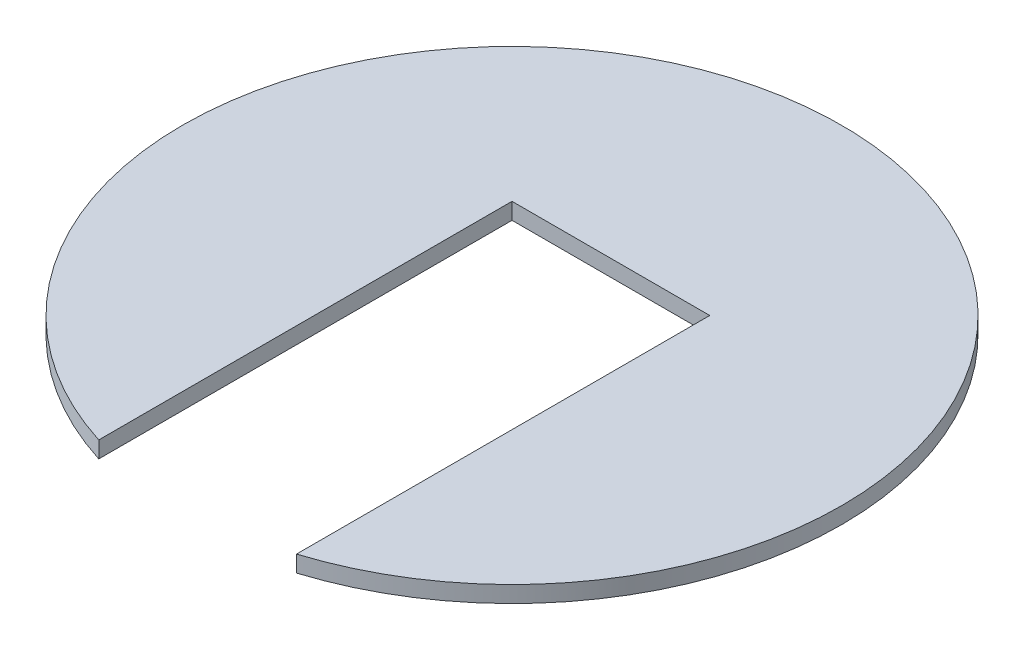
ISO-10303-21;
HEADER;
FILE_DESCRIPTION(('STEP AP214'),'2;1');
FILE_NAME('part.step','',(''),(''),'','','');
FILE_SCHEMA(('AUTOMOTIVE_DESIGN { 1 0 10303 214 1 1 1 1 }'));
ENDSEC;
DATA;
#1=APPLICATION_CONTEXT('core data for automotive mechanical design processes');
#2=APPLICATION_PROTOCOL_DEFINITION('international standard','automotive_design',2000,#1);
#3=PRODUCT_CONTEXT('',#1,'mechanical');
#4=PRODUCT('Part','Part','',(#3));
#5=PRODUCT_RELATED_PRODUCT_CATEGORY('part','',(#4));
#6=PRODUCT_DEFINITION_FORMATION('','',#4);
#7=PRODUCT_DEFINITION_CONTEXT('part definition',#1,'design');
#8=PRODUCT_DEFINITION('design','',#6,#7);
#9=PRODUCT_DEFINITION_SHAPE('','',#8);
#10=(LENGTH_UNIT() NAMED_UNIT(*) SI_UNIT(.MILLI.,.METRE.));
#11=(NAMED_UNIT(*) PLANE_ANGLE_UNIT() SI_UNIT($,.RADIAN.));
#12=(NAMED_UNIT(*) SI_UNIT($,.STERADIAN.) SOLID_ANGLE_UNIT());
#13=UNCERTAINTY_MEASURE_WITH_UNIT(LENGTH_MEASURE(1.E-05),#10,'distance_accuracy_value','');
#14=(GEOMETRIC_REPRESENTATION_CONTEXT(3) GLOBAL_UNCERTAINTY_ASSIGNED_CONTEXT((#13)) GLOBAL_UNIT_ASSIGNED_CONTEXT((#10,
#11,#12)) REPRESENTATION_CONTEXT('',''));
#15=CARTESIAN_POINT('',(0.,0.,0.));
#16=DIRECTION('',(0.,0.,1.));
#17=DIRECTION('',(1.,0.,0.));
#18=AXIS2_PLACEMENT_3D('',#15,#16,#17);
#19=CARTESIAN_POINT('',(0.,0.,0.));
#20=DIRECTION('',(0.,1.,0.));
#21=DIRECTION('',(0.,0.,1.));
#22=AXIS2_PLACEMENT_3D('',#19,#20,#21);
#23=PLANE('',#22);
#24=CARTESIAN_POINT('',(0.,0.,0.));
#25=DIRECTION('',(0.,1.,0.));
#26=DIRECTION('',(0.,0.,1.));
#27=AXIS2_PLACEMENT_3D('',#24,#25,#26);
#28=CIRCLE('',#27,127.);
#29=CARTESIAN_POINT('',(38.099999999999,0.,121.150278579952));
#30=VERTEX_POINT('',#29);
#31=CARTESIAN_POINT('',(-38.099999999999,0.,121.150278579952));
#32=VERTEX_POINT('',#31);
#33=EDGE_CURVE('E36',#30,#32,#28,.T.);
#34=ORIENTED_EDGE('',*,*,#33,.F.);
#35=DIRECTION('',(0.,0.,-1.));
#36=VECTOR('',#35,1.);
#37=CARTESIAN_POINT('',(38.1,0.,-38.1));
#38=LINE('',#37,#36);
#39=CARTESIAN_POINT('',(38.1,0.,-38.1));
#40=VERTEX_POINT('',#39);
#41=EDGE_CURVE('E106',#30,#40,#38,.T.);
#42=ORIENTED_EDGE('',*,*,#41,.T.);
#43=DIRECTION('',(-1.,0.,0.));
#44=VECTOR('',#43,1.);
#45=CARTESIAN_POINT('',(-38.1,0.,-38.1));
#46=LINE('',#45,#44);
#47=CARTESIAN_POINT('',(-38.1,0.,-38.1));
#48=VERTEX_POINT('',#47);
#49=EDGE_CURVE('E73',#40,#48,#46,.T.);
#50=ORIENTED_EDGE('',*,*,#49,.T.);
#51=DIRECTION('',(0.,0.,1.));
#52=VECTOR('',#51,1.);
#53=CARTESIAN_POINT('',(-38.1,0.,142.557146436089));
#54=LINE('',#53,#52);
#55=EDGE_CURVE('E84',#48,#32,#54,.T.);
#56=ORIENTED_EDGE('',*,*,#55,.T.);
#57=EDGE_LOOP('',(#34,#42,#50,#56));
#58=FACE_BOUND('',#57,.T.);
#59=ADVANCED_FACE('F33',(#58),#23,.F.);
#60=CARTESIAN_POINT('',(-38.1,0.,142.557146436089));
#61=DIRECTION('',(-1.,0.,0.));
#62=DIRECTION('',(0.,0.,1.));
#63=AXIS2_PLACEMENT_3D('',#60,#61,#62);
#64=PLANE('',#63);
#65=DIRECTION('',(0.,1.,0.));
#66=VECTOR('',#65,1.);
#67=CARTESIAN_POINT('',(-38.1,0.,-38.1));
#68=LINE('',#67,#66);
#69=CARTESIAN_POINT('',(-38.1,6.35,-38.1));
#70=VERTEX_POINT('',#69);
#71=EDGE_CURVE('E77',#48,#70,#68,.T.);
#72=ORIENTED_EDGE('',*,*,#71,.T.);
#73=DIRECTION('',(0.,0.,1.));
#74=VECTOR('',#73,1.);
#75=CARTESIAN_POINT('',(-38.1,6.35,0.));
#76=LINE('',#75,#74);
#77=CARTESIAN_POINT('',(-38.099999999999,6.35,121.150278579952));
#78=VERTEX_POINT('',#77);
#79=EDGE_CURVE('E82',#78,#70,#76,.F.);
#80=ORIENTED_EDGE('',*,*,#79,.F.);
#81=DIRECTION('',(0.,1.,0.));
#82=VECTOR('',#81,1.);
#83=CARTESIAN_POINT('',(-38.0999999999981,0.,121.150278579953));
#84=LINE('',#83,#82);
#85=EDGE_CURVE('E96',#32,#78,#84,.T.);
#86=ORIENTED_EDGE('',*,*,#85,.F.);
#87=ORIENTED_EDGE('',*,*,#55,.F.);
#88=EDGE_LOOP('',(#72,#80,#86,#87));
#89=FACE_BOUND('',#88,.T.);
#90=ADVANCED_FACE('F79',(#89),#64,.F.);
#91=CARTESIAN_POINT('',(-38.1,0.,-38.1));
#92=DIRECTION('',(0.,0.,-1.));
#93=DIRECTION('',(-1.,0.,0.));
#94=AXIS2_PLACEMENT_3D('',#91,#92,#93);
#95=PLANE('',#94);
#96=DIRECTION('',(0.,1.,0.));
#97=VECTOR('',#96,1.);
#98=CARTESIAN_POINT('',(38.1,0.,-38.1));
#99=LINE('',#98,#97);
#100=CARTESIAN_POINT('',(38.1,6.35,-38.1));
#101=VERTEX_POINT('',#100);
#102=EDGE_CURVE('E90',#40,#101,#99,.T.);
#103=ORIENTED_EDGE('',*,*,#102,.T.);
#104=DIRECTION('',(1.,0.,0.));
#105=VECTOR('',#104,1.);
#106=CARTESIAN_POINT('',(0.,6.35,-38.1));
#107=LINE('',#106,#105);
#108=EDGE_CURVE('E87',#70,#101,#107,.T.);
#109=ORIENTED_EDGE('',*,*,#108,.F.);
#110=ORIENTED_EDGE('',*,*,#71,.F.);
#111=ORIENTED_EDGE('',*,*,#49,.F.);
#112=EDGE_LOOP('',(#103,#109,#110,#111));
#113=FACE_BOUND('',#112,.T.);
#114=ADVANCED_FACE('F88',(#113),#95,.F.);
#115=CARTESIAN_POINT('',(38.1,0.,-38.1));
#116=DIRECTION('',(1.,0.,0.));
#117=DIRECTION('',(0.,0.,-1.));
#118=AXIS2_PLACEMENT_3D('',#115,#116,#117);
#119=PLANE('',#118);
#120=DIRECTION('',(0.,1.,0.));
#121=VECTOR('',#120,1.);
#122=CARTESIAN_POINT('',(38.099999999998,0.,121.150278579953));
#123=LINE('',#122,#121);
#124=CARTESIAN_POINT('',(38.099999999999,6.35,121.150278579952));
#125=VERTEX_POINT('',#124);
#126=EDGE_CURVE('E50',#125,#30,#123,.F.);
#127=ORIENTED_EDGE('',*,*,#126,.F.);
#128=DIRECTION('',(0.,0.,1.));
#129=VECTOR('',#128,1.);
#130=CARTESIAN_POINT('',(38.1,6.35,0.));
#131=LINE('',#130,#129);
#132=EDGE_CURVE('E42',#101,#125,#131,.T.);
#133=ORIENTED_EDGE('',*,*,#132,.F.);
#134=ORIENTED_EDGE('',*,*,#102,.F.);
#135=ORIENTED_EDGE('',*,*,#41,.F.);
#136=EDGE_LOOP('',(#127,#133,#134,#135));
#137=FACE_BOUND('',#136,.T.);
#138=ADVANCED_FACE('F121',(#137),#119,.F.);
#139=CARTESIAN_POINT('',(0.,0.,0.));
#140=DIRECTION('',(0.,1.,0.));
#141=DIRECTION('',(0.,0.,1.));
#142=AXIS2_PLACEMENT_3D('',#139,#140,#141);
#143=CYLINDRICAL_SURFACE('',#142,127.);
#144=CARTESIAN_POINT('',(0.,6.35,0.));
#145=DIRECTION('',(0.,1.,0.));
#146=DIRECTION('',(0.,0.,1.));
#147=AXIS2_PLACEMENT_3D('',#144,#145,#146);
#148=CIRCLE('',#147,127.);
#149=EDGE_CURVE('E11',#125,#78,#148,.T.);
#150=ORIENTED_EDGE('',*,*,#149,.F.);
#151=ORIENTED_EDGE('',*,*,#126,.T.);
#152=ORIENTED_EDGE('',*,*,#33,.T.);
#153=ORIENTED_EDGE('',*,*,#85,.T.);
#154=EDGE_LOOP('',(#150,#151,#152,#153));
#155=FACE_BOUND('',#154,.T.);
#156=ADVANCED_FACE('F123',(#155),#143,.T.);
#157=CARTESIAN_POINT('',(0.,6.35,0.));
#158=DIRECTION('',(0.,1.,0.));
#159=DIRECTION('',(0.,0.,1.));
#160=AXIS2_PLACEMENT_3D('',#157,#158,#159);
#161=PLANE('',#160);
#162=ORIENTED_EDGE('',*,*,#132,.T.);
#163=ORIENTED_EDGE('',*,*,#149,.T.);
#164=ORIENTED_EDGE('',*,*,#79,.T.);
#165=ORIENTED_EDGE('',*,*,#108,.T.);
#166=EDGE_LOOP('',(#162,#163,#164,#165));
#167=FACE_BOUND('',#166,.T.);
#168=ADVANCED_FACE('F94',(#167),#161,.T.);
#169=CLOSED_SHELL('',(#59,#90,#114,#138,#156,#168));
#170=MANIFOLD_SOLID_BREP('B2',#169);
#171=ADVANCED_BREP_SHAPE_REPRESENTATION('',(#18,#170),#14);
#172=SHAPE_DEFINITION_REPRESENTATION(#9,#171);
ENDSEC;
END-ISO-10303-21;
